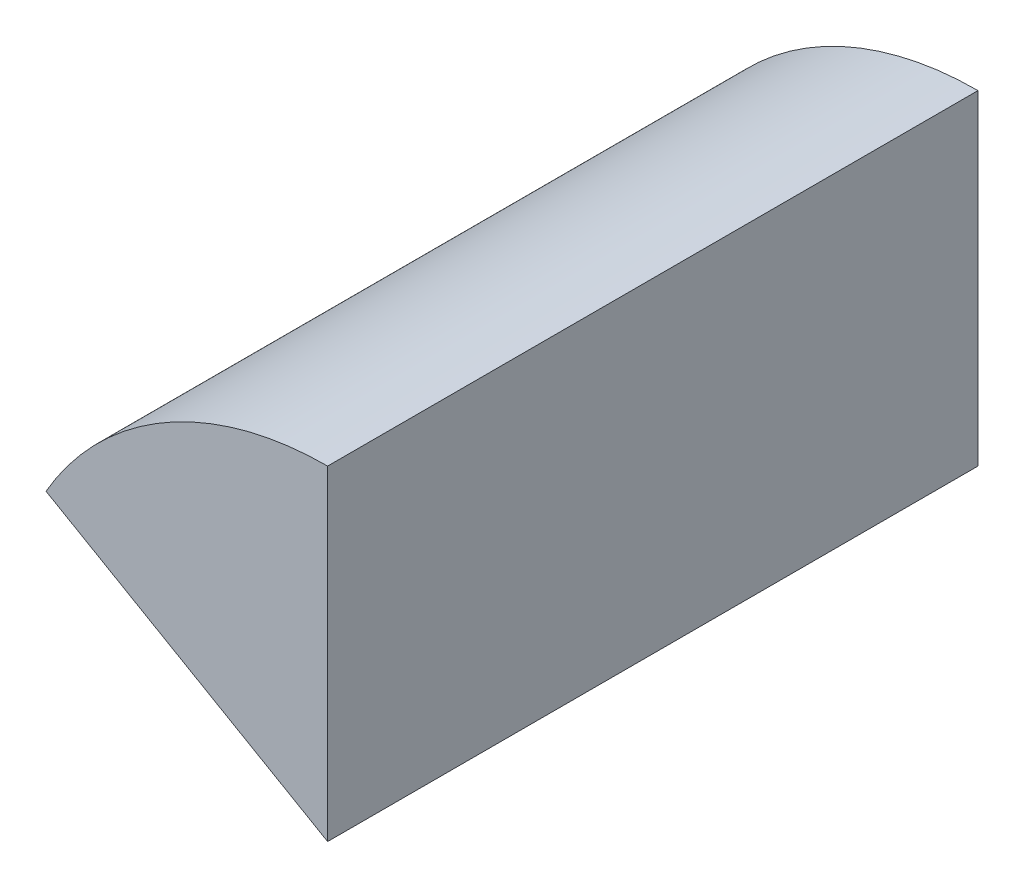
ISO-10303-21;
HEADER;
FILE_DESCRIPTION(('STEP AP214'),'2;1');
FILE_NAME('part.step','',(''),(''),'','','');
FILE_SCHEMA(('AUTOMOTIVE_DESIGN { 1 0 10303 214 1 1 1 1 }'));
ENDSEC;
DATA;
#1=APPLICATION_CONTEXT('core data for automotive mechanical design processes');
#2=APPLICATION_PROTOCOL_DEFINITION('international standard','automotive_design',2000,#1);
#3=PRODUCT_CONTEXT('',#1,'mechanical');
#4=PRODUCT('Part','Part','',(#3));
#5=PRODUCT_RELATED_PRODUCT_CATEGORY('part','',(#4));
#6=PRODUCT_DEFINITION_FORMATION('','',#4);
#7=PRODUCT_DEFINITION_CONTEXT('part definition',#1,'design');
#8=PRODUCT_DEFINITION('design','',#6,#7);
#9=PRODUCT_DEFINITION_SHAPE('','',#8);
#10=(LENGTH_UNIT() NAMED_UNIT(*) SI_UNIT(.MILLI.,.METRE.));
#11=(NAMED_UNIT(*) PLANE_ANGLE_UNIT() SI_UNIT($,.RADIAN.));
#12=(NAMED_UNIT(*) SI_UNIT($,.STERADIAN.) SOLID_ANGLE_UNIT());
#13=UNCERTAINTY_MEASURE_WITH_UNIT(LENGTH_MEASURE(1.E-05),#10,'distance_accuracy_value','');
#14=(GEOMETRIC_REPRESENTATION_CONTEXT(3) GLOBAL_UNCERTAINTY_ASSIGNED_CONTEXT((#13)) GLOBAL_UNIT_ASSIGNED_CONTEXT((#10,
#11,#12)) REPRESENTATION_CONTEXT('',''));
#15=CARTESIAN_POINT('',(0.,0.,0.));
#16=DIRECTION('',(0.,0.,1.));
#17=DIRECTION('',(1.,0.,0.));
#18=AXIS2_PLACEMENT_3D('',#15,#16,#17);
#19=CARTESIAN_POINT('',(-21.650635094611,12.4999999999999,50.));
#20=DIRECTION('',(0.499999999999998,0.86602540378444,0.));
#21=DIRECTION('',(-0.86602540378444,0.499999999999998,0.));
#22=AXIS2_PLACEMENT_3D('',#19,#20,#21);
#23=PLANE('',#22);
#24=DIRECTION('',(0.86602540378444,-0.499999999999998,0.));
#25=VECTOR('',#24,1.);
#26=CARTESIAN_POINT('',(-21.650635094611,12.4999999999999,0.));
#27=LINE('',#26,#25);
#28=CARTESIAN_POINT('',(-21.650635094611,12.4999999999999,0.));
#29=VERTEX_POINT('',#28);
#30=CARTESIAN_POINT('',(0.,0.,0.));
#31=VERTEX_POINT('',#30);
#32=EDGE_CURVE('E80',#29,#31,#27,.T.);
#33=ORIENTED_EDGE('',*,*,#32,.T.);
#34=DIRECTION('',(0.,0.,-1.));
#35=VECTOR('',#34,1.);
#36=CARTESIAN_POINT('',(0.,0.,50.));
#37=LINE('',#36,#35);
#38=CARTESIAN_POINT('',(0.,0.,50.));
#39=VERTEX_POINT('',#38);
#40=EDGE_CURVE('E11',#39,#31,#37,.T.);
#41=ORIENTED_EDGE('',*,*,#40,.F.);
#42=DIRECTION('',(0.86602540378444,-0.499999999999998,0.));
#43=VECTOR('',#42,1.);
#44=CARTESIAN_POINT('',(-21.650635094611,12.4999999999999,50.));
#45=LINE('',#44,#43);
#46=CARTESIAN_POINT('',(-21.650635094611,12.4999999999999,50.));
#47=VERTEX_POINT('',#46);
#48=EDGE_CURVE('E73',#47,#39,#45,.T.);
#49=ORIENTED_EDGE('',*,*,#48,.F.);
#50=DIRECTION('',(0.,0.,-1.));
#51=VECTOR('',#50,1.);
#52=CARTESIAN_POINT('',(-21.650635094611,12.4999999999999,50.));
#53=LINE('',#52,#51);
#54=EDGE_CURVE('E81',#47,#29,#53,.T.);
#55=ORIENTED_EDGE('',*,*,#54,.T.);
#56=EDGE_LOOP('',(#33,#41,#49,#55));
#57=FACE_BOUND('',#56,.T.);
#58=ADVANCED_FACE('F33',(#57),#23,.F.);
#59=CARTESIAN_POINT('',(0.,25.,50.));
#60=DIRECTION('',(-1.,0.,0.));
#61=DIRECTION('',(0.,0.,1.));
#62=AXIS2_PLACEMENT_3D('',#59,#60,#61);
#63=PLANE('',#62);
#64=DIRECTION('',(0.,1.,0.));
#65=VECTOR('',#64,1.);
#66=CARTESIAN_POINT('',(0.,25.,0.));
#67=LINE('',#66,#65);
#68=CARTESIAN_POINT('',(0.,25.,0.));
#69=VERTEX_POINT('',#68);
#70=EDGE_CURVE('E61',#31,#69,#67,.T.);
#71=ORIENTED_EDGE('',*,*,#70,.T.);
#72=DIRECTION('',(0.,0.,-1.));
#73=VECTOR('',#72,1.);
#74=CARTESIAN_POINT('',(0.,25.,50.));
#75=LINE('',#74,#73);
#76=CARTESIAN_POINT('',(0.,25.,50.));
#77=VERTEX_POINT('',#76);
#78=EDGE_CURVE('E41',#77,#69,#75,.T.);
#79=ORIENTED_EDGE('',*,*,#78,.F.);
#80=DIRECTION('',(0.,1.,0.));
#81=VECTOR('',#80,1.);
#82=CARTESIAN_POINT('',(0.,25.,50.));
#83=LINE('',#82,#81);
#84=EDGE_CURVE('E69',#39,#77,#83,.T.);
#85=ORIENTED_EDGE('',*,*,#84,.F.);
#86=ORIENTED_EDGE('',*,*,#40,.T.);
#87=EDGE_LOOP('',(#71,#79,#85,#86));
#88=FACE_BOUND('',#87,.T.);
#89=ADVANCED_FACE('F70',(#88),#63,.F.);
#90=CARTESIAN_POINT('',(0.,0.,50.));
#91=DIRECTION('',(0.,0.,-1.));
#92=DIRECTION('',(-1.,0.,0.));
#93=AXIS2_PLACEMENT_3D('',#90,#91,#92);
#94=CYLINDRICAL_SURFACE('',#93,25.);
#95=CARTESIAN_POINT('',(0.,0.,0.));
#96=DIRECTION('',(0.,0.,1.));
#97=DIRECTION('',(1.,0.,0.));
#98=AXIS2_PLACEMENT_3D('',#95,#96,#97);
#99=CIRCLE('',#98,25.);
#100=EDGE_CURVE('E66',#69,#29,#99,.T.);
#101=ORIENTED_EDGE('',*,*,#100,.T.);
#102=ORIENTED_EDGE('',*,*,#54,.F.);
#103=CARTESIAN_POINT('',(0.,0.,50.));
#104=DIRECTION('',(0.,0.,1.));
#105=DIRECTION('',(1.,0.,0.));
#106=AXIS2_PLACEMENT_3D('',#103,#104,#105);
#107=CIRCLE('',#106,25.);
#108=EDGE_CURVE('E49',#77,#47,#107,.T.);
#109=ORIENTED_EDGE('',*,*,#108,.F.);
#110=ORIENTED_EDGE('',*,*,#78,.T.);
#111=EDGE_LOOP('',(#101,#102,#109,#110));
#112=FACE_BOUND('',#111,.T.);
#113=ADVANCED_FACE('F92',(#112),#94,.T.);
#114=CARTESIAN_POINT('',(0.,0.,50.));
#115=DIRECTION('',(0.,0.,1.));
#116=DIRECTION('',(1.,0.,0.));
#117=AXIS2_PLACEMENT_3D('',#114,#115,#116);
#118=PLANE('',#117);
#119=ORIENTED_EDGE('',*,*,#48,.T.);
#120=ORIENTED_EDGE('',*,*,#84,.T.);
#121=ORIENTED_EDGE('',*,*,#108,.T.);
#122=EDGE_LOOP('',(#119,#120,#121));
#123=FACE_BOUND('',#122,.T.);
#124=ADVANCED_FACE('F76',(#123),#118,.T.);
#125=CARTESIAN_POINT('',(0.,0.,0.));
#126=DIRECTION('',(0.,0.,1.));
#127=DIRECTION('',(1.,0.,0.));
#128=AXIS2_PLACEMENT_3D('',#125,#126,#127);
#129=PLANE('',#128);
#130=CARTESIAN_POINT('',(-7.78206773691423,14.0406452165108,0.));
#131=DIRECTION('',(0.,0.,-1.));
#132=DIRECTION('',(-1.,0.,0.));
#133=AXIS2_PLACEMENT_3D('',#130,#131,#132);
#134=CIRCLE('',#133,5.);
#135=CARTESIAN_POINT('',(-12.7820677369142,14.0406452165108,0.));
#136=VERTEX_POINT('',#135);
#137=EDGE_CURVE('E87',#136,#136,#134,.T.);
#138=ORIENTED_EDGE('',*,*,#137,.F.);
#139=EDGE_LOOP('',(#138));
#140=FACE_BOUND('',#139,.T.);
#141=ORIENTED_EDGE('',*,*,#32,.F.);
#142=ORIENTED_EDGE('',*,*,#100,.F.);
#143=ORIENTED_EDGE('',*,*,#70,.F.);
#144=EDGE_LOOP('',(#141,#142,#143));
#145=FACE_BOUND('',#144,.T.);
#146=ADVANCED_FACE('F93',(#140,#145),#129,.F.);
#147=CARTESIAN_POINT('',(-7.78206773691423,14.0406452165108,10.));
#148=DIRECTION('',(0.,0.,-1.));
#149=DIRECTION('',(-1.,0.,0.));
#150=AXIS2_PLACEMENT_3D('',#147,#148,#149);
#151=CYLINDRICAL_SURFACE('',#150,5.);
#152=CARTESIAN_POINT('',(-7.78206773691423,14.0406452165108,10.));
#153=DIRECTION('',(0.,0.,-1.));
#154=DIRECTION('',(-1.,0.,0.));
#155=AXIS2_PLACEMENT_3D('',#152,#153,#154);
#156=CIRCLE('',#155,5.);
#157=CARTESIAN_POINT('',(-12.7820677369142,14.0406452165108,10.));
#158=VERTEX_POINT('',#157);
#159=EDGE_CURVE('E83',#158,#158,#156,.T.);
#160=ORIENTED_EDGE('',*,*,#159,.F.);
#161=EDGE_LOOP('',(#160));
#162=FACE_BOUND('',#161,.T.);
#163=ORIENTED_EDGE('',*,*,#137,.T.);
#164=EDGE_LOOP('',(#163));
#165=FACE_BOUND('',#164,.T.);
#166=ADVANCED_FACE('F95',(#162,#165),#151,.F.);
#167=CARTESIAN_POINT('',(-7.78206773691423,14.0406452165108,10.));
#168=DIRECTION('',(0.,0.,-1.));
#169=DIRECTION('',(-1.,0.,0.));
#170=AXIS2_PLACEMENT_3D('',#167,#168,#169);
#171=PLANE('',#170);
#172=ORIENTED_EDGE('',*,*,#159,.T.);
#173=EDGE_LOOP('',(#172));
#174=FACE_BOUND('',#173,.T.);
#175=ADVANCED_FACE('F102',(#174),#171,.T.);
#176=CLOSED_SHELL('',(#58,#89,#113,#124,#146,#166,#175));
#177=MANIFOLD_SOLID_BREP('B2',#176);
#178=ADVANCED_BREP_SHAPE_REPRESENTATION('',(#18,#177),#14);
#179=SHAPE_DEFINITION_REPRESENTATION(#9,#178);
ENDSEC;
END-ISO-10303-21;
